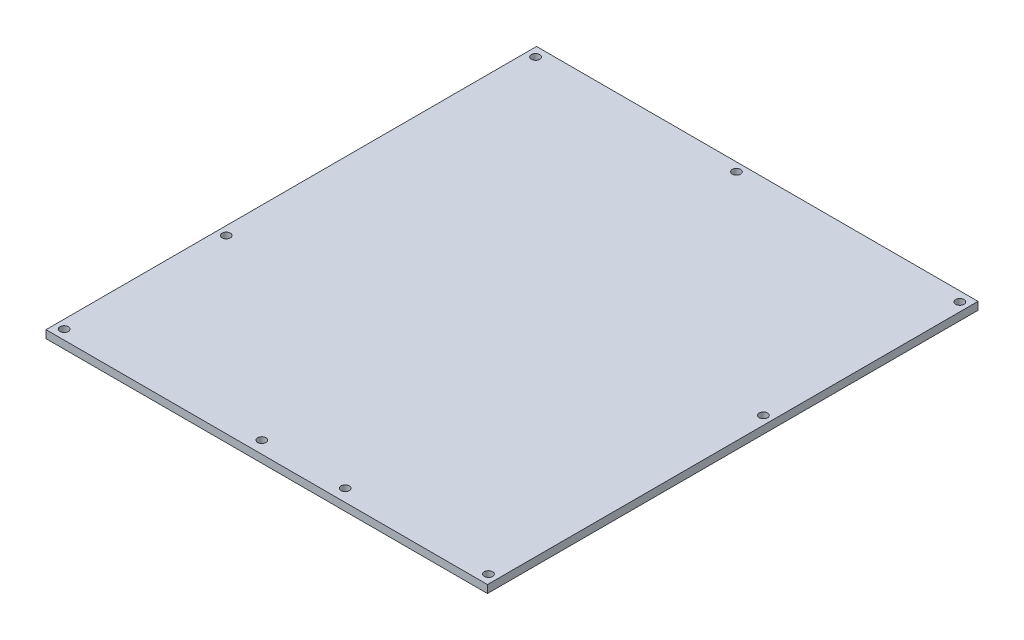
ISO-10303-21;
HEADER;
FILE_DESCRIPTION(('STEP AP214'),'2;1');
FILE_NAME('part.step','',(''),(''),'','','');
FILE_SCHEMA(('AUTOMOTIVE_DESIGN { 1 0 10303 214 1 1 1 1 }'));
ENDSEC;
DATA;
#1=APPLICATION_CONTEXT('core data for automotive mechanical design processes');
#2=APPLICATION_PROTOCOL_DEFINITION('international standard','automotive_design',2000,#1);
#3=PRODUCT_CONTEXT('',#1,'mechanical');
#4=PRODUCT('Part','Part','',(#3));
#5=PRODUCT_RELATED_PRODUCT_CATEGORY('part','',(#4));
#6=PRODUCT_DEFINITION_FORMATION('','',#4);
#7=PRODUCT_DEFINITION_CONTEXT('part definition',#1,'design');
#8=PRODUCT_DEFINITION('design','',#6,#7);
#9=PRODUCT_DEFINITION_SHAPE('','',#8);
#10=(LENGTH_UNIT() NAMED_UNIT(*) SI_UNIT(.MILLI.,.METRE.));
#11=(NAMED_UNIT(*) PLANE_ANGLE_UNIT() SI_UNIT($,.RADIAN.));
#12=(NAMED_UNIT(*) SI_UNIT($,.STERADIAN.) SOLID_ANGLE_UNIT());
#13=UNCERTAINTY_MEASURE_WITH_UNIT(LENGTH_MEASURE(1.E-05),#10,'distance_accuracy_value','');
#14=(GEOMETRIC_REPRESENTATION_CONTEXT(3) GLOBAL_UNCERTAINTY_ASSIGNED_CONTEXT((#13)) GLOBAL_UNIT_ASSIGNED_CONTEXT((#10,
#11,#12)) REPRESENTATION_CONTEXT('',''));
#15=CARTESIAN_POINT('',(0.,0.,0.));
#16=DIRECTION('',(0.,0.,1.));
#17=DIRECTION('',(1.,0.,0.));
#18=AXIS2_PLACEMENT_3D('',#15,#16,#17);
#19=CARTESIAN_POINT('',(0.,3.175,0.));
#20=DIRECTION('',(0.,1.,0.));
#21=DIRECTION('',(0.,0.,1.));
#22=AXIS2_PLACEMENT_3D('',#19,#20,#21);
#23=PLANE('',#22);
#24=CARTESIAN_POINT('',(86.499999959,3.175,-15.999999975));
#25=DIRECTION('',(0.,1.,0.));
#26=DIRECTION('',(0.,0.,1.));
#27=AXIS2_PLACEMENT_3D('',#24,#25,#26);
#28=CIRCLE('',#27,1.70000000000001);
#29=CARTESIAN_POINT('',(86.499999959,3.175,-14.299999975));
#30=VERTEX_POINT('',#29);
#31=EDGE_CURVE('E188',#30,#30,#28,.T.);
#32=ORIENTED_EDGE('',*,*,#31,.F.);
#33=EDGE_LOOP('',(#32));
#34=FACE_BOUND('',#33,.T.);
#35=CARTESIAN_POINT('',(27.000000041,3.175,95.000000025));
#36=DIRECTION('',(0.,1.,0.));
#37=DIRECTION('',(0.,0.,1.));
#38=AXIS2_PLACEMENT_3D('',#35,#36,#37);
#39=CIRCLE('',#38,1.7);
#40=CARTESIAN_POINT('',(27.000000041,3.175,96.700000025));
#41=VERTEX_POINT('',#40);
#42=EDGE_CURVE('E172',#41,#41,#39,.T.);
#43=ORIENTED_EDGE('',*,*,#42,.F.);
#44=EDGE_LOOP('',(#43));
#45=FACE_BOUND('',#44,.T.);
#46=CARTESIAN_POINT('',(-86.499999959,3.175,96.1111111333673));
#47=DIRECTION('',(0.,1.,0.));
#48=DIRECTION('',(0.,0.,1.));
#49=AXIS2_PLACEMENT_3D('',#46,#47,#48);
#50=CIRCLE('',#49,1.7);
#51=CARTESIAN_POINT('',(-86.499999959,3.175,97.8111111333673));
#52=VERTEX_POINT('',#51);
#53=EDGE_CURVE('E156',#52,#52,#50,.T.);
#54=ORIENTED_EDGE('',*,*,#53,.F.);
#55=EDGE_LOOP('',(#54));
#56=FACE_BOUND('',#55,.T.);
#57=CARTESIAN_POINT('',(-4.99999995899998,3.175,-96.500000025));
#58=DIRECTION('',(0.,1.,0.));
#59=DIRECTION('',(0.,0.,1.));
#60=AXIS2_PLACEMENT_3D('',#57,#58,#59);
#61=CIRCLE('',#60,1.7);
#62=CARTESIAN_POINT('',(-4.99999995899998,3.175,-94.800000025));
#63=VERTEX_POINT('',#62);
#64=EDGE_CURVE('E140',#63,#63,#61,.T.);
#65=ORIENTED_EDGE('',*,*,#64,.F.);
#66=EDGE_LOOP('',(#65));
#67=FACE_BOUND('',#66,.T.);
#68=DIRECTION('',(0.,0.,-1.));
#69=VECTOR('',#68,1.);
#70=CARTESIAN_POINT('',(89.999999959,3.175,-100.000000025));
#71=LINE('',#70,#69);
#72=CARTESIAN_POINT('',(89.999999959,3.175,100.000000025));
#73=VERTEX_POINT('',#72);
#74=CARTESIAN_POINT('',(89.999999959,3.175,-100.000000025));
#75=VERTEX_POINT('',#74);
#76=EDGE_CURVE('E98',#73,#75,#71,.T.);
#77=ORIENTED_EDGE('',*,*,#76,.T.);
#78=DIRECTION('',(-1.,0.,0.));
#79=VECTOR('',#78,1.);
#80=CARTESIAN_POINT('',(-89.999999959,3.175,-100.000000025));
#81=LINE('',#80,#79);
#82=CARTESIAN_POINT('',(-89.999999959,3.175,-100.000000025));
#83=VERTEX_POINT('',#82);
#84=EDGE_CURVE('E93',#75,#83,#81,.T.);
#85=ORIENTED_EDGE('',*,*,#84,.T.);
#86=DIRECTION('',(0.,0.,1.));
#87=VECTOR('',#86,1.);
#88=CARTESIAN_POINT('',(-89.999999959,3.175,-100.000000025));
#89=LINE('',#88,#87);
#90=CARTESIAN_POINT('',(-89.999999959,3.175,100.000000025));
#91=VERTEX_POINT('',#90);
#92=EDGE_CURVE('E96',#83,#91,#89,.T.);
#93=ORIENTED_EDGE('',*,*,#92,.T.);
#94=DIRECTION('',(1.,0.,0.));
#95=VECTOR('',#94,1.);
#96=CARTESIAN_POINT('',(-89.999999959,3.175,100.000000025));
#97=LINE('',#96,#95);
#98=EDGE_CURVE('E63',#91,#73,#97,.T.);
#99=ORIENTED_EDGE('',*,*,#98,.T.);
#100=EDGE_LOOP('',(#77,#85,#93,#99));
#101=FACE_BOUND('',#100,.T.);
#102=CARTESIAN_POINT('',(-86.499999959,3.175,-96.1111111333673));
#103=DIRECTION('',(0.,1.,0.));
#104=DIRECTION('',(0.,0.,1.));
#105=AXIS2_PLACEMENT_3D('',#102,#103,#104);
#106=CIRCLE('',#105,1.7);
#107=CARTESIAN_POINT('',(-86.499999959,3.175,-94.4111111333673));
#108=VERTEX_POINT('',#107);
#109=EDGE_CURVE('E118',#108,#108,#106,.T.);
#110=ORIENTED_EDGE('',*,*,#109,.F.);
#111=EDGE_LOOP('',(#110));
#112=FACE_BOUND('',#111,.T.);
#113=CARTESIAN_POINT('',(86.500000041,3.175,-96.1111112244784));
#114=DIRECTION('',(0.,1.,0.));
#115=DIRECTION('',(0.,0.,1.));
#116=AXIS2_PLACEMENT_3D('',#113,#114,#115);
#117=CIRCLE('',#116,1.7);
#118=CARTESIAN_POINT('',(86.500000041,3.175,-94.4111112244784));
#119=VERTEX_POINT('',#118);
#120=EDGE_CURVE('E148',#119,#119,#117,.T.);
#121=ORIENTED_EDGE('',*,*,#120,.F.);
#122=EDGE_LOOP('',(#121));
#123=FACE_BOUND('',#122,.T.);
#124=CARTESIAN_POINT('',(-6.98999995899999,3.175,95.000000025));
#125=DIRECTION('',(0.,1.,0.));
#126=DIRECTION('',(0.,0.,1.));
#127=AXIS2_PLACEMENT_3D('',#124,#125,#126);
#128=CIRCLE('',#127,1.70000000000001);
#129=CARTESIAN_POINT('',(-6.98999995899999,3.175,96.700000025));
#130=VERTEX_POINT('',#129);
#131=EDGE_CURVE('E164',#130,#130,#128,.T.);
#132=ORIENTED_EDGE('',*,*,#131,.F.);
#133=EDGE_LOOP('',(#132));
#134=FACE_BOUND('',#133,.T.);
#135=CARTESIAN_POINT('',(86.500000041,3.175,96.1111112244784));
#136=DIRECTION('',(0.,1.,0.));
#137=DIRECTION('',(0.,0.,1.));
#138=AXIS2_PLACEMENT_3D('',#135,#136,#137);
#139=CIRCLE('',#138,1.70000000000001);
#140=CARTESIAN_POINT('',(86.500000041,3.175,97.8111112244784));
#141=VERTEX_POINT('',#140);
#142=EDGE_CURVE('E180',#141,#141,#139,.T.);
#143=ORIENTED_EDGE('',*,*,#142,.F.);
#144=EDGE_LOOP('',(#143));
#145=FACE_BOUND('',#144,.T.);
#146=CARTESIAN_POINT('',(-86.499999959,3.175,30.000000025));
#147=DIRECTION('',(0.,1.,0.));
#148=DIRECTION('',(0.,0.,1.));
#149=AXIS2_PLACEMENT_3D('',#146,#147,#148);
#150=CIRCLE('',#149,1.70000000000001);
#151=CARTESIAN_POINT('',(-86.499999959,3.175,31.700000025));
#152=VERTEX_POINT('',#151);
#153=EDGE_CURVE('E196',#152,#152,#150,.T.);
#154=ORIENTED_EDGE('',*,*,#153,.F.);
#155=EDGE_LOOP('',(#154));
#156=FACE_BOUND('',#155,.T.);
#157=ADVANCED_FACE('F45',(#34,#45,#56,#67,#101,#112,#123,#134,#145,#156),#23,.T.);
#158=CARTESIAN_POINT('',(0.,0.,0.));
#159=DIRECTION('',(0.,1.,0.));
#160=DIRECTION('',(0.,0.,1.));
#161=AXIS2_PLACEMENT_3D('',#158,#159,#160);
#162=PLANE('',#161);
#163=DIRECTION('',(0.,0.,-1.));
#164=VECTOR('',#163,1.);
#165=CARTESIAN_POINT('',(89.999999959,0.,-100.000000025));
#166=LINE('',#165,#164);
#167=CARTESIAN_POINT('',(89.999999959,0.,100.000000025));
#168=VERTEX_POINT('',#167);
#169=CARTESIAN_POINT('',(89.999999959,0.,-100.000000025));
#170=VERTEX_POINT('',#169);
#171=EDGE_CURVE('E114',#168,#170,#166,.T.);
#172=ORIENTED_EDGE('',*,*,#171,.F.);
#173=DIRECTION('',(1.,0.,0.));
#174=VECTOR('',#173,1.);
#175=CARTESIAN_POINT('',(-89.999999959,0.,100.000000025));
#176=LINE('',#175,#174);
#177=CARTESIAN_POINT('',(-89.999999959,0.,100.000000025));
#178=VERTEX_POINT('',#177);
#179=EDGE_CURVE('E86',#178,#168,#176,.T.);
#180=ORIENTED_EDGE('',*,*,#179,.F.);
#181=DIRECTION('',(0.,0.,1.));
#182=VECTOR('',#181,1.);
#183=CARTESIAN_POINT('',(-89.999999959,0.,-100.000000025));
#184=LINE('',#183,#182);
#185=CARTESIAN_POINT('',(-89.999999959,0.,-100.000000025));
#186=VERTEX_POINT('',#185);
#187=EDGE_CURVE('E80',#186,#178,#184,.T.);
#188=ORIENTED_EDGE('',*,*,#187,.F.);
#189=DIRECTION('',(-1.,0.,0.));
#190=VECTOR('',#189,1.);
#191=CARTESIAN_POINT('',(-89.999999959,0.,-100.000000025));
#192=LINE('',#191,#190);
#193=EDGE_CURVE('E103',#170,#186,#192,.T.);
#194=ORIENTED_EDGE('',*,*,#193,.F.);
#195=EDGE_LOOP('',(#172,#180,#188,#194));
#196=FACE_BOUND('',#195,.T.);
#197=CARTESIAN_POINT('',(-86.499999959,0.,-96.1111111333673));
#198=DIRECTION('',(0.,1.,0.));
#199=DIRECTION('',(0.,0.,1.));
#200=AXIS2_PLACEMENT_3D('',#197,#198,#199);
#201=CIRCLE('',#200,1.7);
#202=CARTESIAN_POINT('',(-86.499999959,0.,-94.4111111333673));
#203=VERTEX_POINT('',#202);
#204=EDGE_CURVE('E136',#203,#203,#201,.T.);
#205=ORIENTED_EDGE('',*,*,#204,.T.);
#206=EDGE_LOOP('',(#205));
#207=FACE_BOUND('',#206,.T.);
#208=CARTESIAN_POINT('',(-4.99999995899998,0.,-96.500000025));
#209=DIRECTION('',(0.,1.,0.));
#210=DIRECTION('',(0.,0.,1.));
#211=AXIS2_PLACEMENT_3D('',#208,#209,#210);
#212=CIRCLE('',#211,1.7);
#213=CARTESIAN_POINT('',(-4.99999995899998,0.,-94.800000025));
#214=VERTEX_POINT('',#213);
#215=EDGE_CURVE('E144',#214,#214,#212,.T.);
#216=ORIENTED_EDGE('',*,*,#215,.T.);
#217=EDGE_LOOP('',(#216));
#218=FACE_BOUND('',#217,.T.);
#219=CARTESIAN_POINT('',(86.500000041,0.,-96.1111112244784));
#220=DIRECTION('',(0.,1.,0.));
#221=DIRECTION('',(0.,0.,1.));
#222=AXIS2_PLACEMENT_3D('',#219,#220,#221);
#223=CIRCLE('',#222,1.7);
#224=CARTESIAN_POINT('',(86.500000041,0.,-94.4111112244784));
#225=VERTEX_POINT('',#224);
#226=EDGE_CURVE('E152',#225,#225,#223,.T.);
#227=ORIENTED_EDGE('',*,*,#226,.T.);
#228=EDGE_LOOP('',(#227));
#229=FACE_BOUND('',#228,.T.);
#230=CARTESIAN_POINT('',(-86.499999959,0.,96.1111111333673));
#231=DIRECTION('',(0.,1.,0.));
#232=DIRECTION('',(0.,0.,1.));
#233=AXIS2_PLACEMENT_3D('',#230,#231,#232);
#234=CIRCLE('',#233,1.7);
#235=CARTESIAN_POINT('',(-86.499999959,0.,97.8111111333673));
#236=VERTEX_POINT('',#235);
#237=EDGE_CURVE('E160',#236,#236,#234,.T.);
#238=ORIENTED_EDGE('',*,*,#237,.T.);
#239=EDGE_LOOP('',(#238));
#240=FACE_BOUND('',#239,.T.);
#241=CARTESIAN_POINT('',(-6.98999995899999,0.,95.000000025));
#242=DIRECTION('',(0.,1.,0.));
#243=DIRECTION('',(0.,0.,1.));
#244=AXIS2_PLACEMENT_3D('',#241,#242,#243);
#245=CIRCLE('',#244,1.70000000000001);
#246=CARTESIAN_POINT('',(-6.98999995899999,0.,96.700000025));
#247=VERTEX_POINT('',#246);
#248=EDGE_CURVE('E168',#247,#247,#245,.T.);
#249=ORIENTED_EDGE('',*,*,#248,.T.);
#250=EDGE_LOOP('',(#249));
#251=FACE_BOUND('',#250,.T.);
#252=CARTESIAN_POINT('',(27.000000041,0.,95.000000025));
#253=DIRECTION('',(0.,1.,0.));
#254=DIRECTION('',(0.,0.,1.));
#255=AXIS2_PLACEMENT_3D('',#252,#253,#254);
#256=CIRCLE('',#255,1.7);
#257=CARTESIAN_POINT('',(27.000000041,0.,96.700000025));
#258=VERTEX_POINT('',#257);
#259=EDGE_CURVE('E176',#258,#258,#256,.T.);
#260=ORIENTED_EDGE('',*,*,#259,.T.);
#261=EDGE_LOOP('',(#260));
#262=FACE_BOUND('',#261,.T.);
#263=CARTESIAN_POINT('',(86.500000041,0.,96.1111112244784));
#264=DIRECTION('',(0.,1.,0.));
#265=DIRECTION('',(0.,0.,1.));
#266=AXIS2_PLACEMENT_3D('',#263,#264,#265);
#267=CIRCLE('',#266,1.70000000000001);
#268=CARTESIAN_POINT('',(86.500000041,0.,97.8111112244784));
#269=VERTEX_POINT('',#268);
#270=EDGE_CURVE('E184',#269,#269,#267,.T.);
#271=ORIENTED_EDGE('',*,*,#270,.T.);
#272=EDGE_LOOP('',(#271));
#273=FACE_BOUND('',#272,.T.);
#274=CARTESIAN_POINT('',(86.499999959,0.,-15.999999975));
#275=DIRECTION('',(0.,1.,0.));
#276=DIRECTION('',(0.,0.,1.));
#277=AXIS2_PLACEMENT_3D('',#274,#275,#276);
#278=CIRCLE('',#277,1.70000000000001);
#279=CARTESIAN_POINT('',(86.499999959,0.,-14.299999975));
#280=VERTEX_POINT('',#279);
#281=EDGE_CURVE('E192',#280,#280,#278,.T.);
#282=ORIENTED_EDGE('',*,*,#281,.T.);
#283=EDGE_LOOP('',(#282));
#284=FACE_BOUND('',#283,.T.);
#285=CARTESIAN_POINT('',(-86.499999959,0.,30.000000025));
#286=DIRECTION('',(0.,1.,0.));
#287=DIRECTION('',(0.,0.,1.));
#288=AXIS2_PLACEMENT_3D('',#285,#286,#287);
#289=CIRCLE('',#288,1.70000000000001);
#290=CARTESIAN_POINT('',(-86.499999959,0.,31.700000025));
#291=VERTEX_POINT('',#290);
#292=EDGE_CURVE('E200',#291,#291,#289,.T.);
#293=ORIENTED_EDGE('',*,*,#292,.T.);
#294=EDGE_LOOP('',(#293));
#295=FACE_BOUND('',#294,.T.);
#296=ADVANCED_FACE('F131',(#196,#207,#218,#229,#240,#251,#262,#273,#284,#295),#162,.F.);
#297=CARTESIAN_POINT('',(89.999999959,3.175,-100.000000025));
#298=DIRECTION('',(-1.,0.,0.));
#299=DIRECTION('',(0.,0.,1.));
#300=AXIS2_PLACEMENT_3D('',#297,#298,#299);
#301=PLANE('',#300);
#302=ORIENTED_EDGE('',*,*,#171,.T.);
#303=DIRECTION('',(0.,-1.,0.));
#304=VECTOR('',#303,1.);
#305=CARTESIAN_POINT('',(89.999999959,3.175,-100.000000025));
#306=LINE('',#305,#304);
#307=EDGE_CURVE('E11',#75,#170,#306,.T.);
#308=ORIENTED_EDGE('',*,*,#307,.F.);
#309=ORIENTED_EDGE('',*,*,#76,.F.);
#310=DIRECTION('',(0.,-1.,0.));
#311=VECTOR('',#310,1.);
#312=CARTESIAN_POINT('',(89.999999959,3.175,100.000000025));
#313=LINE('',#312,#311);
#314=EDGE_CURVE('E110',#73,#168,#313,.T.);
#315=ORIENTED_EDGE('',*,*,#314,.T.);
#316=EDGE_LOOP('',(#302,#308,#309,#315));
#317=FACE_BOUND('',#316,.T.);
#318=ADVANCED_FACE('F47',(#317),#301,.F.);
#319=CARTESIAN_POINT('',(-89.999999959,3.175,-100.000000025));
#320=DIRECTION('',(0.,0.,1.));
#321=DIRECTION('',(1.,0.,0.));
#322=AXIS2_PLACEMENT_3D('',#319,#320,#321);
#323=PLANE('',#322);
#324=ORIENTED_EDGE('',*,*,#193,.T.);
#325=DIRECTION('',(0.,-1.,0.));
#326=VECTOR('',#325,1.);
#327=CARTESIAN_POINT('',(-89.999999959,3.175,-100.000000025));
#328=LINE('',#327,#326);
#329=EDGE_CURVE('E55',#83,#186,#328,.T.);
#330=ORIENTED_EDGE('',*,*,#329,.F.);
#331=ORIENTED_EDGE('',*,*,#84,.F.);
#332=ORIENTED_EDGE('',*,*,#307,.T.);
#333=EDGE_LOOP('',(#324,#330,#331,#332));
#334=FACE_BOUND('',#333,.T.);
#335=ADVANCED_FACE('F102',(#334),#323,.F.);
#336=CARTESIAN_POINT('',(-89.999999959,3.175,-100.000000025));
#337=DIRECTION('',(1.,0.,0.));
#338=DIRECTION('',(0.,0.,-1.));
#339=AXIS2_PLACEMENT_3D('',#336,#337,#338);
#340=PLANE('',#339);
#341=ORIENTED_EDGE('',*,*,#187,.T.);
#342=DIRECTION('',(0.,-1.,0.));
#343=VECTOR('',#342,1.);
#344=CARTESIAN_POINT('',(-89.999999959,3.175,100.000000025));
#345=LINE('',#344,#343);
#346=EDGE_CURVE('E105',#91,#178,#345,.T.);
#347=ORIENTED_EDGE('',*,*,#346,.F.);
#348=ORIENTED_EDGE('',*,*,#92,.F.);
#349=ORIENTED_EDGE('',*,*,#329,.T.);
#350=EDGE_LOOP('',(#341,#347,#348,#349));
#351=FACE_BOUND('',#350,.T.);
#352=ADVANCED_FACE('F106',(#351),#340,.F.);
#353=CARTESIAN_POINT('',(-89.999999959,3.175,100.000000025));
#354=DIRECTION('',(0.,0.,-1.));
#355=DIRECTION('',(-1.,0.,0.));
#356=AXIS2_PLACEMENT_3D('',#353,#354,#355);
#357=PLANE('',#356);
#358=ORIENTED_EDGE('',*,*,#179,.T.);
#359=ORIENTED_EDGE('',*,*,#314,.F.);
#360=ORIENTED_EDGE('',*,*,#98,.F.);
#361=ORIENTED_EDGE('',*,*,#346,.T.);
#362=EDGE_LOOP('',(#358,#359,#360,#361));
#363=FACE_BOUND('',#362,.T.);
#364=ADVANCED_FACE('F128',(#363),#357,.F.);
#365=CARTESIAN_POINT('',(-86.499999959,3.175,-96.1111111333673));
#366=DIRECTION('',(0.,-1.,0.));
#367=DIRECTION('',(0.,0.,-1.));
#368=AXIS2_PLACEMENT_3D('',#365,#366,#367);
#369=CYLINDRICAL_SURFACE('',#368,1.7);
#370=ORIENTED_EDGE('',*,*,#109,.T.);
#371=EDGE_LOOP('',(#370));
#372=FACE_BOUND('',#371,.T.);
#373=ORIENTED_EDGE('',*,*,#204,.F.);
#374=EDGE_LOOP('',(#373));
#375=FACE_BOUND('',#374,.T.);
#376=ADVANCED_FACE('F221',(#372,#375),#369,.F.);
#377=CARTESIAN_POINT('',(-4.99999995899998,3.175,-96.500000025));
#378=DIRECTION('',(0.,-1.,0.));
#379=DIRECTION('',(0.,0.,-1.));
#380=AXIS2_PLACEMENT_3D('',#377,#378,#379);
#381=CYLINDRICAL_SURFACE('',#380,1.7);
#382=ORIENTED_EDGE('',*,*,#64,.T.);
#383=EDGE_LOOP('',(#382));
#384=FACE_BOUND('',#383,.T.);
#385=ORIENTED_EDGE('',*,*,#215,.F.);
#386=EDGE_LOOP('',(#385));
#387=FACE_BOUND('',#386,.T.);
#388=ADVANCED_FACE('F266',(#384,#387),#381,.F.);
#389=CARTESIAN_POINT('',(86.500000041,3.175,-96.1111112244784));
#390=DIRECTION('',(0.,-1.,0.));
#391=DIRECTION('',(0.,0.,-1.));
#392=AXIS2_PLACEMENT_3D('',#389,#390,#391);
#393=CYLINDRICAL_SURFACE('',#392,1.7);
#394=ORIENTED_EDGE('',*,*,#120,.T.);
#395=EDGE_LOOP('',(#394));
#396=FACE_BOUND('',#395,.T.);
#397=ORIENTED_EDGE('',*,*,#226,.F.);
#398=EDGE_LOOP('',(#397));
#399=FACE_BOUND('',#398,.T.);
#400=ADVANCED_FACE('F274',(#396,#399),#393,.F.);
#401=CARTESIAN_POINT('',(-86.499999959,3.175,96.1111111333673));
#402=DIRECTION('',(0.,-1.,0.));
#403=DIRECTION('',(0.,0.,-1.));
#404=AXIS2_PLACEMENT_3D('',#401,#402,#403);
#405=CYLINDRICAL_SURFACE('',#404,1.7);
#406=ORIENTED_EDGE('',*,*,#53,.T.);
#407=EDGE_LOOP('',(#406));
#408=FACE_BOUND('',#407,.T.);
#409=ORIENTED_EDGE('',*,*,#237,.F.);
#410=EDGE_LOOP('',(#409));
#411=FACE_BOUND('',#410,.T.);
#412=ADVANCED_FACE('F282',(#408,#411),#405,.F.);
#413=CARTESIAN_POINT('',(-6.98999995899999,3.175,95.000000025));
#414=DIRECTION('',(0.,-1.,0.));
#415=DIRECTION('',(0.,0.,-1.));
#416=AXIS2_PLACEMENT_3D('',#413,#414,#415);
#417=CYLINDRICAL_SURFACE('',#416,1.70000000000001);
#418=ORIENTED_EDGE('',*,*,#131,.T.);
#419=EDGE_LOOP('',(#418));
#420=FACE_BOUND('',#419,.T.);
#421=ORIENTED_EDGE('',*,*,#248,.F.);
#422=EDGE_LOOP('',(#421));
#423=FACE_BOUND('',#422,.T.);
#424=ADVANCED_FACE('F291',(#420,#423),#417,.F.);
#425=CARTESIAN_POINT('',(27.000000041,3.175,95.000000025));
#426=DIRECTION('',(0.,-1.,0.));
#427=DIRECTION('',(0.,0.,-1.));
#428=AXIS2_PLACEMENT_3D('',#425,#426,#427);
#429=CYLINDRICAL_SURFACE('',#428,1.7);
#430=ORIENTED_EDGE('',*,*,#42,.T.);
#431=EDGE_LOOP('',(#430));
#432=FACE_BOUND('',#431,.T.);
#433=ORIENTED_EDGE('',*,*,#259,.F.);
#434=EDGE_LOOP('',(#433));
#435=FACE_BOUND('',#434,.T.);
#436=ADVANCED_FACE('F300',(#432,#435),#429,.F.);
#437=CARTESIAN_POINT('',(86.500000041,3.175,96.1111112244784));
#438=DIRECTION('',(0.,-1.,0.));
#439=DIRECTION('',(0.,0.,-1.));
#440=AXIS2_PLACEMENT_3D('',#437,#438,#439);
#441=CYLINDRICAL_SURFACE('',#440,1.70000000000001);
#442=ORIENTED_EDGE('',*,*,#142,.T.);
#443=EDGE_LOOP('',(#442));
#444=FACE_BOUND('',#443,.T.);
#445=ORIENTED_EDGE('',*,*,#270,.F.);
#446=EDGE_LOOP('',(#445));
#447=FACE_BOUND('',#446,.T.);
#448=ADVANCED_FACE('F309',(#444,#447),#441,.F.);
#449=CARTESIAN_POINT('',(86.499999959,3.175,-15.999999975));
#450=DIRECTION('',(0.,-1.,0.));
#451=DIRECTION('',(0.,0.,-1.));
#452=AXIS2_PLACEMENT_3D('',#449,#450,#451);
#453=CYLINDRICAL_SURFACE('',#452,1.70000000000001);
#454=ORIENTED_EDGE('',*,*,#31,.T.);
#455=EDGE_LOOP('',(#454));
#456=FACE_BOUND('',#455,.T.);
#457=ORIENTED_EDGE('',*,*,#281,.F.);
#458=EDGE_LOOP('',(#457));
#459=FACE_BOUND('',#458,.T.);
#460=ADVANCED_FACE('F318',(#456,#459),#453,.F.);
#461=CARTESIAN_POINT('',(-86.499999959,3.175,30.000000025));
#462=DIRECTION('',(0.,-1.,0.));
#463=DIRECTION('',(0.,0.,-1.));
#464=AXIS2_PLACEMENT_3D('',#461,#462,#463);
#465=CYLINDRICAL_SURFACE('',#464,1.70000000000001);
#466=ORIENTED_EDGE('',*,*,#153,.T.);
#467=EDGE_LOOP('',(#466));
#468=FACE_BOUND('',#467,.T.);
#469=ORIENTED_EDGE('',*,*,#292,.F.);
#470=EDGE_LOOP('',(#469));
#471=FACE_BOUND('',#470,.T.);
#472=ADVANCED_FACE('F208',(#468,#471),#465,.F.);
#473=CLOSED_SHELL('',(#157,#296,#318,#335,#352,#364,#376,#388,#400,#412,#424,#436,#448,#460,#472));
#474=MANIFOLD_SOLID_BREP('B2',#473);
#475=ADVANCED_BREP_SHAPE_REPRESENTATION('',(#18,#474),#14);
#476=SHAPE_DEFINITION_REPRESENTATION(#9,#475);
ENDSEC;
END-ISO-10303-21;
